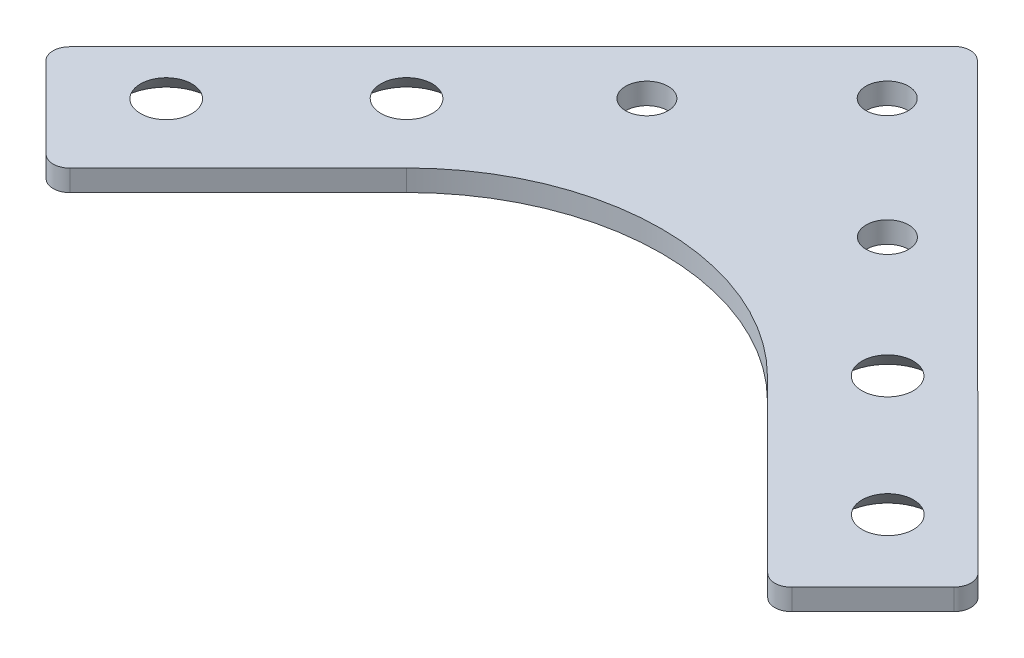
ISO-10303-21;
HEADER;
FILE_DESCRIPTION(('STEP AP214'),'2;1');
FILE_NAME('part.step','',(''),(''),'','','');
FILE_SCHEMA(('AUTOMOTIVE_DESIGN { 1 0 10303 214 1 1 1 1 }'));
ENDSEC;
DATA;
#1=APPLICATION_CONTEXT('core data for automotive mechanical design processes');
#2=APPLICATION_PROTOCOL_DEFINITION('international standard','automotive_design',2000,#1);
#3=PRODUCT_CONTEXT('',#1,'mechanical');
#4=PRODUCT('Part','Part','',(#3));
#5=PRODUCT_RELATED_PRODUCT_CATEGORY('part','',(#4));
#6=PRODUCT_DEFINITION_FORMATION('','',#4);
#7=PRODUCT_DEFINITION_CONTEXT('part definition',#1,'design');
#8=PRODUCT_DEFINITION('design','',#6,#7);
#9=PRODUCT_DEFINITION_SHAPE('','',#8);
#10=(LENGTH_UNIT() NAMED_UNIT(*) SI_UNIT(.MILLI.,.METRE.));
#11=(NAMED_UNIT(*) PLANE_ANGLE_UNIT() SI_UNIT($,.RADIAN.));
#12=(NAMED_UNIT(*) SI_UNIT($,.STERADIAN.) SOLID_ANGLE_UNIT());
#13=UNCERTAINTY_MEASURE_WITH_UNIT(LENGTH_MEASURE(1.E-05),#10,'distance_accuracy_value','');
#14=(GEOMETRIC_REPRESENTATION_CONTEXT(3) GLOBAL_UNCERTAINTY_ASSIGNED_CONTEXT((#13)) GLOBAL_UNIT_ASSIGNED_CONTEXT((#10,
#11,#12)) REPRESENTATION_CONTEXT('',''));
#15=CARTESIAN_POINT('',(0.,0.,0.));
#16=DIRECTION('',(0.,0.,1.));
#17=DIRECTION('',(1.,0.,0.));
#18=AXIS2_PLACEMENT_3D('',#15,#16,#17);
#19=CARTESIAN_POINT('',(175.177811216833,43.8333628767299,-652.315866193784));
#20=DIRECTION('',(0.,1.,0.));
#21=DIRECTION('',(-1.,0.,0.));
#22=AXIS2_PLACEMENT_3D('',#19,#20,#21);
#23=PLANE('',#22);
#24=CARTESIAN_POINT('',(139.293069628941,43.8333628767299,-606.488126001078));
#25=DIRECTION('',(0.,1.,0.));
#26=DIRECTION('',(-1.,0.,0.));
#27=AXIS2_PLACEMENT_3D('',#24,#25,#26);
#28=CIRCLE('',#27,3.84401460743349);
#29=CARTESIAN_POINT('',(135.449055021507,43.8333628767299,-606.488126001078));
#30=VERTEX_POINT('',#29);
#31=EDGE_CURVE('E415',#30,#30,#28,.T.);
#32=ORIENTED_EDGE('',*,*,#31,.F.);
#33=EDGE_LOOP('',(#32));
#34=FACE_BOUND('',#33,.T.);
#35=CARTESIAN_POINT('',(211.135096067288,43.8333628767299,-606.545022677597));
#36=DIRECTION('',(0.,1.,0.));
#37=DIRECTION('',(-1.,0.,0.));
#38=AXIS2_PLACEMENT_3D('',#35,#36,#37);
#39=CIRCLE('',#38,3.84401460743349);
#40=CARTESIAN_POINT('',(207.291081459855,43.8333628767299,-606.545022677597));
#41=VERTEX_POINT('',#40);
#42=EDGE_CURVE('E431',#41,#41,#39,.T.);
#43=ORIENTED_EDGE('',*,*,#42,.F.);
#44=EDGE_LOOP('',(#43));
#45=FACE_BOUND('',#44,.T.);
#46=CARTESIAN_POINT('',(229.109826846005,43.8333628767299,-588.598740237141));
#47=DIRECTION('',(0.,1.,0.));
#48=DIRECTION('',(-1.,0.,0.));
#49=AXIS2_PLACEMENT_3D('',#46,#47,#48);
#50=CIRCLE('',#49,3.84401460743349);
#51=CARTESIAN_POINT('',(225.265812238571,43.8333628767299,-588.598740237141));
#52=VERTEX_POINT('',#51);
#53=EDGE_CURVE('E41',#52,#52,#50,.T.);
#54=ORIENTED_EDGE('',*,*,#53,.F.);
#55=EDGE_LOOP('',(#54));
#56=FACE_BOUND('',#55,.T.);
#57=CARTESIAN_POINT('',(175.177811216833,43.8333628767299,-652.315866193784));
#58=DIRECTION('',(0.,1.,0.));
#59=DIRECTION('',(-1.,0.,0.));
#60=AXIS2_PLACEMENT_3D('',#57,#58,#59);
#61=CIRCLE('',#60,2.53999999999991);
#62=CARTESIAN_POINT('',(176.972439460879,43.8333628767299,-654.113339271656));
#63=VERTEX_POINT('',#62);
#64=CARTESIAN_POINT('',(173.380338138962,43.8333628767299,-654.11049443783));
#65=VERTEX_POINT('',#64);
#66=EDGE_CURVE('E157',#63,#65,#61,.T.);
#67=ORIENTED_EDGE('',*,*,#66,.T.);
#68=DIRECTION('',(0.706546552773901,0.,-0.707666566091204));
#69=VECTOR('',#68,1.);
#70=CARTESIAN_POINT('',(107.427750170282,43.8333628767299,-588.053358826047));
#71=LINE('',#70,#69);
#72=CARTESIAN_POINT('',(107.427750170282,43.8333628767299,-588.053358826047));
#73=VERTEX_POINT('',#72);
#74=EDGE_CURVE('E160',#73,#65,#71,.T.);
#75=ORIENTED_EDGE('',*,*,#74,.F.);
#76=CARTESIAN_POINT('',(109.225223248154,43.8333628767299,-586.258730582001));
#77=DIRECTION('',(0.,-1.,0.));
#78=DIRECTION('',(1.,0.,0.));
#79=AXIS2_PLACEMENT_3D('',#76,#77,#78);
#80=CIRCLE('',#79,2.54000000000001);
#81=CARTESIAN_POINT('',(107.430595004108,43.8333628767299,-584.461257504129));
#82=VERTEX_POINT('',#81);
#83=EDGE_CURVE('E164',#82,#73,#80,.T.);
#84=ORIENTED_EDGE('',*,*,#83,.F.);
#85=DIRECTION('',(0.707666566091211,0.,0.706546552773894));
#86=VECTOR('',#85,1.);
#87=CARTESIAN_POINT('',(107.430595004108,43.8333628767299,-584.461257504129));
#88=LINE('',#87,#86);
#89=CARTESIAN_POINT('',(119.563538279742,43.8333628767299,-572.347516856821));
#90=VERTEX_POINT('',#89);
#91=EDGE_CURVE('E166',#82,#90,#88,.T.);
#92=ORIENTED_EDGE('',*,*,#91,.T.);
#93=CARTESIAN_POINT('',(121.358166523788,43.8333628767299,-574.144989934692));
#94=DIRECTION('',(0.,1.,0.));
#95=DIRECTION('',(-1.,0.,0.));
#96=AXIS2_PLACEMENT_3D('',#93,#94,#95);
#97=CIRCLE('',#96,2.53999999999996);
#98=CARTESIAN_POINT('',(123.15563960166,43.8333628767299,-572.350361690647));
#99=VERTEX_POINT('',#98);
#100=EDGE_CURVE('E169',#90,#99,#97,.T.);
#101=ORIENTED_EDGE('',*,*,#100,.T.);
#102=DIRECTION('',(-0.706546552773895,0.,0.70766656609121));
#103=VECTOR('',#102,1.);
#104=CARTESIAN_POINT('',(148.280435018299,43.8333628767299,-597.51498478085));
#105=LINE('',#104,#103);
#106=CARTESIAN_POINT('',(148.280435018299,43.8333628767299,-597.51498478085));
#107=VERTEX_POINT('',#106);
#108=EDGE_CURVE('E172',#107,#99,#105,.T.);
#109=ORIENTED_EDGE('',*,*,#108,.F.);
#110=CARTESIAN_POINT('',(175.242531186374,43.8333628767299,-570.595561120164));
#111=DIRECTION('',(0.,1.,0.));
#112=DIRECTION('',(-1.,0.,0.));
#113=AXIS2_PLACEMENT_3D('',#110,#111,#112);
#114=CIRCLE('',#113,38.1);
#115=CARTESIAN_POINT('',(202.16195484706,43.8333628767299,-597.557657288239));
#116=VERTEX_POINT('',#115);
#117=EDGE_CURVE('E175',#116,#107,#114,.T.);
#118=ORIENTED_EDGE('',*,*,#117,.F.);
#119=DIRECTION('',(-0.70766656609121,0.,-0.706546552773896));
#120=VECTOR('',#119,1.);
#121=CARTESIAN_POINT('',(227.727905917185,43.8333628767299,-572.032169067485));
#122=LINE('',#121,#120);
#123=CARTESIAN_POINT('',(227.727905917185,43.8333628767299,-572.032169067485));
#124=VERTEX_POINT('',#123);
#125=EDGE_CURVE('E177',#124,#116,#122,.T.);
#126=ORIENTED_EDGE('',*,*,#125,.F.);
#127=CARTESIAN_POINT('',(229.52253416123,43.8333628767299,-573.829642145356));
#128=DIRECTION('',(0.,-1.,0.));
#129=DIRECTION('',(1.,0.,0.));
#130=AXIS2_PLACEMENT_3D('',#127,#128,#129);
#131=CIRCLE('',#130,2.53999999999996);
#132=CARTESIAN_POINT('',(231.320007239102,43.8333628767299,-572.035013901311));
#133=VERTEX_POINT('',#132);
#134=EDGE_CURVE('E179',#133,#124,#131,.T.);
#135=ORIENTED_EDGE('',*,*,#134,.F.);
#136=DIRECTION('',(-0.706546552773897,0.,0.707666566091208));
#137=VECTOR('',#136,1.);
#138=CARTESIAN_POINT('',(243.43374788641,43.8333628767299,-584.167957176944));
#139=LINE('',#138,#137);
#140=CARTESIAN_POINT('',(243.43374788641,43.8333628767299,-584.167957176944));
#141=VERTEX_POINT('',#140);
#142=EDGE_CURVE('E181',#141,#133,#139,.T.);
#143=ORIENTED_EDGE('',*,*,#142,.F.);
#144=CARTESIAN_POINT('',(241.636274808538,43.8333628767299,-585.96258542099));
#145=DIRECTION('',(0.,1.,0.));
#146=DIRECTION('',(-1.,0.,0.));
#147=AXIS2_PLACEMENT_3D('',#144,#145,#146);
#148=CIRCLE('',#147,2.54000000000002);
#149=CARTESIAN_POINT('',(243.430903052584,43.8333628767299,-587.760058498861));
#150=VERTEX_POINT('',#149);
#151=EDGE_CURVE('E138',#141,#150,#148,.T.);
#152=ORIENTED_EDGE('',*,*,#151,.T.);
#153=DIRECTION('',(0.707666566091204,0.,0.706546552773901));
#154=VECTOR('',#153,1.);
#155=CARTESIAN_POINT('',(176.972439460879,43.8333628767299,-654.113339271656));
#156=LINE('',#155,#154);
#157=EDGE_CURVE('E184',#63,#150,#156,.T.);
#158=ORIENTED_EDGE('',*,*,#157,.F.);
#159=EDGE_LOOP('',(#67,#75,#84,#92,#101,#109,#118,#126,#135,#143,#152,#158));
#160=FACE_BOUND('',#159,.T.);
#161=CARTESIAN_POINT('',(157.239352069398,43.8333628767299,-624.462856779795));
#162=DIRECTION('',(0.,-1.,0.));
#163=DIRECTION('',(0.,0.,-1.));
#164=AXIS2_PLACEMENT_3D('',#161,#162,#163);
#165=CIRCLE('',#164,3.17499999999998);
#166=CARTESIAN_POINT('',(157.239352069398,43.8333628767299,-627.637856779795));
#167=VERTEX_POINT('',#166);
#168=EDGE_CURVE('E161',#167,#167,#165,.T.);
#169=ORIENTED_EDGE('',*,*,#168,.T.);
#170=EDGE_LOOP('',(#169));
#171=FACE_BOUND('',#170,.T.);
#172=CARTESIAN_POINT('',(193.160365288572,43.8333628767299,-624.491305118054));
#173=DIRECTION('',(0.,-1.,0.));
#174=DIRECTION('',(0.,0.,-1.));
#175=AXIS2_PLACEMENT_3D('',#172,#173,#174);
#176=CIRCLE('',#175,3.17499999999998);
#177=CARTESIAN_POINT('',(193.160365288572,43.8333628767299,-627.666305118054));
#178=VERTEX_POINT('',#177);
#179=EDGE_CURVE('E446',#178,#178,#176,.T.);
#180=ORIENTED_EDGE('',*,*,#179,.T.);
#181=EDGE_LOOP('',(#180));
#182=FACE_BOUND('',#181,.T.);
#183=CARTESIAN_POINT('',(175.185634509855,43.8333628767299,-642.437587558512));
#184=DIRECTION('',(0.,-1.,0.));
#185=DIRECTION('',(0.,0.,-1.));
#186=AXIS2_PLACEMENT_3D('',#183,#184,#185);
#187=CIRCLE('',#186,3.17499999999998);
#188=CARTESIAN_POINT('',(175.185634509855,43.8333628767299,-645.612587558512));
#189=VERTEX_POINT('',#188);
#190=EDGE_CURVE('E440',#189,#189,#187,.T.);
#191=ORIENTED_EDGE('',*,*,#190,.T.);
#192=EDGE_LOOP('',(#191));
#193=FACE_BOUND('',#192,.T.);
#194=CARTESIAN_POINT('',(121.346787188484,43.8333628767299,-588.513395222362));
#195=DIRECTION('',(0.,1.,0.));
#196=DIRECTION('',(-1.,0.,0.));
#197=AXIS2_PLACEMENT_3D('',#194,#195,#196);
#198=CIRCLE('',#197,3.84401460743348);
#199=CARTESIAN_POINT('',(117.50277258105,43.8333628767299,-588.513395222362));
#200=VERTEX_POINT('',#199);
#201=EDGE_CURVE('E425',#200,#200,#198,.T.);
#202=ORIENTED_EDGE('',*,*,#201,.F.);
#203=EDGE_LOOP('',(#202));
#204=FACE_BOUND('',#203,.T.);
#205=ADVANCED_FACE('F37',(#34,#45,#56,#160,#171,#182,#193,#204),#23,.T.);
#206=CARTESIAN_POINT('',(175.177811216833,40.6583628767299,-652.315866193784));
#207=DIRECTION('',(0.,1.,0.));
#208=DIRECTION('',(-1.,0.,0.));
#209=AXIS2_PLACEMENT_3D('',#206,#207,#208);
#210=CYLINDRICAL_SURFACE('',#209,2.53999999999991);
#211=ORIENTED_EDGE('',*,*,#66,.F.);
#212=DIRECTION('',(0.,1.,0.));
#213=VECTOR('',#212,1.);
#214=CARTESIAN_POINT('',(176.972439460879,40.6583628767299,-654.113339271656));
#215=LINE('',#214,#213);
#216=CARTESIAN_POINT('',(176.972439460879,40.6583628767299,-654.113339271656));
#217=VERTEX_POINT('',#216);
#218=EDGE_CURVE('E11',#217,#63,#215,.T.);
#219=ORIENTED_EDGE('',*,*,#218,.F.);
#220=CARTESIAN_POINT('',(175.177811216833,40.6583628767299,-652.315866193784));
#221=DIRECTION('',(0.,1.,0.));
#222=DIRECTION('',(-1.,0.,0.));
#223=AXIS2_PLACEMENT_3D('',#220,#221,#222);
#224=CIRCLE('',#223,2.53999999999991);
#225=CARTESIAN_POINT('',(173.380338138962,40.6583628767299,-654.11049443783));
#226=VERTEX_POINT('',#225);
#227=EDGE_CURVE('E185',#217,#226,#224,.T.);
#228=ORIENTED_EDGE('',*,*,#227,.T.);
#229=DIRECTION('',(0.,1.,0.));
#230=VECTOR('',#229,1.);
#231=CARTESIAN_POINT('',(173.380338138962,40.6583628767299,-654.11049443783));
#232=LINE('',#231,#230);
#233=EDGE_CURVE('E153',#226,#65,#232,.T.);
#234=ORIENTED_EDGE('',*,*,#233,.T.);
#235=EDGE_LOOP('',(#211,#219,#228,#234));
#236=FACE_BOUND('',#235,.T.);
#237=ADVANCED_FACE('F39',(#236),#210,.T.);
#238=CARTESIAN_POINT('',(176.972439460879,40.6583628767299,-654.113339271656));
#239=DIRECTION('',(-0.706546552773901,0.,0.707666566091204));
#240=DIRECTION('',(0.707666566091204,0.,0.706546552773901));
#241=AXIS2_PLACEMENT_3D('',#238,#239,#240);
#242=PLANE('',#241);
#243=ORIENTED_EDGE('',*,*,#157,.T.);
#244=DIRECTION('',(0.,1.,0.));
#245=VECTOR('',#244,1.);
#246=CARTESIAN_POINT('',(243.430903052584,40.6583628767299,-587.760058498861));
#247=LINE('',#246,#245);
#248=CARTESIAN_POINT('',(243.430903052584,40.6583628767299,-587.760058498861));
#249=VERTEX_POINT('',#248);
#250=EDGE_CURVE('E47',#249,#150,#247,.T.);
#251=ORIENTED_EDGE('',*,*,#250,.F.);
#252=DIRECTION('',(0.707666566091204,0.,0.706546552773901));
#253=VECTOR('',#252,1.);
#254=CARTESIAN_POINT('',(176.972439460879,40.6583628767299,-654.113339271656));
#255=LINE('',#254,#253);
#256=EDGE_CURVE('E151',#217,#249,#255,.T.);
#257=ORIENTED_EDGE('',*,*,#256,.F.);
#258=ORIENTED_EDGE('',*,*,#218,.T.);
#259=EDGE_LOOP('',(#243,#251,#257,#258));
#260=FACE_BOUND('',#259,.T.);
#261=ADVANCED_FACE('F213',(#260),#242,.F.);
#262=CARTESIAN_POINT('',(241.636274808538,40.6583628767299,-585.96258542099));
#263=DIRECTION('',(0.,1.,0.));
#264=DIRECTION('',(-1.,0.,0.));
#265=AXIS2_PLACEMENT_3D('',#262,#263,#264);
#266=CYLINDRICAL_SURFACE('',#265,2.54000000000002);
#267=ORIENTED_EDGE('',*,*,#151,.F.);
#268=DIRECTION('',(0.,1.,0.));
#269=VECTOR('',#268,1.);
#270=CARTESIAN_POINT('',(243.43374788641,40.6583628767299,-584.167957176944));
#271=LINE('',#270,#269);
#272=CARTESIAN_POINT('',(243.43374788641,40.6583628767299,-584.167957176944));
#273=VERTEX_POINT('',#272);
#274=EDGE_CURVE('E132',#273,#141,#271,.T.);
#275=ORIENTED_EDGE('',*,*,#274,.F.);
#276=CARTESIAN_POINT('',(241.636274808538,40.6583628767299,-585.96258542099));
#277=DIRECTION('',(0.,1.,0.));
#278=DIRECTION('',(-1.,0.,0.));
#279=AXIS2_PLACEMENT_3D('',#276,#277,#278);
#280=CIRCLE('',#279,2.54000000000002);
#281=EDGE_CURVE('E136',#273,#249,#280,.T.);
#282=ORIENTED_EDGE('',*,*,#281,.T.);
#283=ORIENTED_EDGE('',*,*,#250,.T.);
#284=EDGE_LOOP('',(#267,#275,#282,#283));
#285=FACE_BOUND('',#284,.T.);
#286=ADVANCED_FACE('F134',(#285),#266,.T.);
#287=CARTESIAN_POINT('',(243.43374788641,40.6583628767299,-584.167957176944));
#288=DIRECTION('',(-0.707666566091208,0.,-0.706546552773897));
#289=DIRECTION('',(-0.706546552773897,0.,0.707666566091208));
#290=AXIS2_PLACEMENT_3D('',#287,#288,#289);
#291=PLANE('',#290);
#292=ORIENTED_EDGE('',*,*,#142,.T.);
#293=DIRECTION('',(0.,1.,0.));
#294=VECTOR('',#293,1.);
#295=CARTESIAN_POINT('',(231.320007239102,40.6583628767299,-572.035013901311));
#296=LINE('',#295,#294);
#297=CARTESIAN_POINT('',(231.320007239102,40.6583628767299,-572.035013901311));
#298=VERTEX_POINT('',#297);
#299=EDGE_CURVE('E141',#298,#133,#296,.T.);
#300=ORIENTED_EDGE('',*,*,#299,.F.);
#301=DIRECTION('',(-0.706546552773897,0.,0.707666566091208));
#302=VECTOR('',#301,1.);
#303=CARTESIAN_POINT('',(243.43374788641,40.6583628767299,-584.167957176944));
#304=LINE('',#303,#302);
#305=EDGE_CURVE('E144',#273,#298,#304,.T.);
#306=ORIENTED_EDGE('',*,*,#305,.F.);
#307=ORIENTED_EDGE('',*,*,#274,.T.);
#308=EDGE_LOOP('',(#292,#300,#306,#307));
#309=FACE_BOUND('',#308,.T.);
#310=ADVANCED_FACE('F145',(#309),#291,.F.);
#311=CARTESIAN_POINT('',(229.52253416123,40.6583628767299,-573.829642145356));
#312=DIRECTION('',(0.,1.,0.));
#313=DIRECTION('',(-1.,0.,0.));
#314=AXIS2_PLACEMENT_3D('',#311,#312,#313);
#315=CYLINDRICAL_SURFACE('',#314,2.53999999999996);
#316=ORIENTED_EDGE('',*,*,#134,.T.);
#317=DIRECTION('',(0.,1.,0.));
#318=VECTOR('',#317,1.);
#319=CARTESIAN_POINT('',(227.727905917185,40.6583628767299,-572.032169067485));
#320=LINE('',#319,#318);
#321=CARTESIAN_POINT('',(227.727905917185,40.6583628767299,-572.032169067485));
#322=VERTEX_POINT('',#321);
#323=EDGE_CURVE('E189',#322,#124,#320,.T.);
#324=ORIENTED_EDGE('',*,*,#323,.F.);
#325=CARTESIAN_POINT('',(229.52253416123,40.6583628767299,-573.829642145356));
#326=DIRECTION('',(0.,-1.,0.));
#327=DIRECTION('',(1.,0.,0.));
#328=AXIS2_PLACEMENT_3D('',#325,#326,#327);
#329=CIRCLE('',#328,2.53999999999996);
#330=EDGE_CURVE('E148',#298,#322,#329,.T.);
#331=ORIENTED_EDGE('',*,*,#330,.F.);
#332=ORIENTED_EDGE('',*,*,#299,.T.);
#333=EDGE_LOOP('',(#316,#324,#331,#332));
#334=FACE_BOUND('',#333,.T.);
#335=ADVANCED_FACE('F236',(#334),#315,.T.);
#336=CARTESIAN_POINT('',(227.727905917185,40.6583628767299,-572.032169067485));
#337=DIRECTION('',(0.706546552773896,0.,-0.70766656609121));
#338=DIRECTION('',(-0.70766656609121,0.,-0.706546552773896));
#339=AXIS2_PLACEMENT_3D('',#336,#337,#338);
#340=PLANE('',#339);
#341=ORIENTED_EDGE('',*,*,#125,.T.);
#342=DIRECTION('',(0.,1.,0.));
#343=VECTOR('',#342,1.);
#344=CARTESIAN_POINT('',(202.16195484706,40.6583628767299,-597.557657288239));
#345=LINE('',#344,#343);
#346=CARTESIAN_POINT('',(202.16195484706,40.6583628767299,-597.557657288239));
#347=VERTEX_POINT('',#346);
#348=EDGE_CURVE('E192',#347,#116,#345,.T.);
#349=ORIENTED_EDGE('',*,*,#348,.F.);
#350=DIRECTION('',(-0.70766656609121,0.,-0.706546552773896));
#351=VECTOR('',#350,1.);
#352=CARTESIAN_POINT('',(227.727905917185,40.6583628767299,-572.032169067485));
#353=LINE('',#352,#351);
#354=EDGE_CURVE('E231',#322,#347,#353,.T.);
#355=ORIENTED_EDGE('',*,*,#354,.F.);
#356=ORIENTED_EDGE('',*,*,#323,.T.);
#357=EDGE_LOOP('',(#341,#349,#355,#356));
#358=FACE_BOUND('',#357,.T.);
#359=ADVANCED_FACE('F240',(#358),#340,.F.);
#360=CARTESIAN_POINT('',(175.242531186374,40.6583628767299,-570.595561120164));
#361=DIRECTION('',(0.,1.,0.));
#362=DIRECTION('',(-1.,0.,0.));
#363=AXIS2_PLACEMENT_3D('',#360,#361,#362);
#364=CYLINDRICAL_SURFACE('',#363,38.1);
#365=ORIENTED_EDGE('',*,*,#117,.T.);
#366=DIRECTION('',(0.,1.,0.));
#367=VECTOR('',#366,1.);
#368=CARTESIAN_POINT('',(148.280435018299,40.6583628767299,-597.51498478085));
#369=LINE('',#368,#367);
#370=CARTESIAN_POINT('',(148.280435018299,40.6583628767299,-597.51498478085));
#371=VERTEX_POINT('',#370);
#372=EDGE_CURVE('E195',#371,#107,#369,.T.);
#373=ORIENTED_EDGE('',*,*,#372,.F.);
#374=CARTESIAN_POINT('',(175.242531186374,40.6583628767299,-570.595561120164));
#375=DIRECTION('',(0.,1.,0.));
#376=DIRECTION('',(-1.,0.,0.));
#377=AXIS2_PLACEMENT_3D('',#374,#375,#376);
#378=CIRCLE('',#377,38.1);
#379=EDGE_CURVE('E229',#347,#371,#378,.T.);
#380=ORIENTED_EDGE('',*,*,#379,.F.);
#381=ORIENTED_EDGE('',*,*,#348,.T.);
#382=EDGE_LOOP('',(#365,#373,#380,#381));
#383=FACE_BOUND('',#382,.T.);
#384=ADVANCED_FACE('F245',(#383),#364,.F.);
#385=CARTESIAN_POINT('',(148.280435018299,40.6583628767299,-597.51498478085));
#386=DIRECTION('',(-0.70766656609121,0.,-0.706546552773895));
#387=DIRECTION('',(-0.706546552773895,0.,0.70766656609121));
#388=AXIS2_PLACEMENT_3D('',#385,#386,#387);
#389=PLANE('',#388);
#390=ORIENTED_EDGE('',*,*,#108,.T.);
#391=DIRECTION('',(0.,1.,0.));
#392=VECTOR('',#391,1.);
#393=CARTESIAN_POINT('',(123.15563960166,40.6583628767299,-572.350361690647));
#394=LINE('',#393,#392);
#395=CARTESIAN_POINT('',(123.15563960166,40.6583628767299,-572.350361690647));
#396=VERTEX_POINT('',#395);
#397=EDGE_CURVE('E198',#396,#99,#394,.T.);
#398=ORIENTED_EDGE('',*,*,#397,.F.);
#399=DIRECTION('',(-0.706546552773895,0.,0.70766656609121));
#400=VECTOR('',#399,1.);
#401=CARTESIAN_POINT('',(148.280435018299,40.6583628767299,-597.51498478085));
#402=LINE('',#401,#400);
#403=EDGE_CURVE('E227',#371,#396,#402,.T.);
#404=ORIENTED_EDGE('',*,*,#403,.F.);
#405=ORIENTED_EDGE('',*,*,#372,.T.);
#406=EDGE_LOOP('',(#390,#398,#404,#405));
#407=FACE_BOUND('',#406,.T.);
#408=ADVANCED_FACE('F251',(#407),#389,.F.);
#409=CARTESIAN_POINT('',(121.358166523788,40.6583628767299,-574.144989934692));
#410=DIRECTION('',(0.,1.,0.));
#411=DIRECTION('',(-1.,0.,0.));
#412=AXIS2_PLACEMENT_3D('',#409,#410,#411);
#413=CYLINDRICAL_SURFACE('',#412,2.53999999999996);
#414=ORIENTED_EDGE('',*,*,#100,.F.);
#415=DIRECTION('',(0.,1.,0.));
#416=VECTOR('',#415,1.);
#417=CARTESIAN_POINT('',(119.563538279742,40.6583628767299,-572.347516856821));
#418=LINE('',#417,#416);
#419=CARTESIAN_POINT('',(119.563538279742,40.6583628767299,-572.347516856821));
#420=VERTEX_POINT('',#419);
#421=EDGE_CURVE('E200',#420,#90,#418,.T.);
#422=ORIENTED_EDGE('',*,*,#421,.F.);
#423=CARTESIAN_POINT('',(121.358166523788,40.6583628767299,-574.144989934692));
#424=DIRECTION('',(0.,1.,0.));
#425=DIRECTION('',(-1.,0.,0.));
#426=AXIS2_PLACEMENT_3D('',#423,#424,#425);
#427=CIRCLE('',#426,2.53999999999996);
#428=EDGE_CURVE('E224',#420,#396,#427,.T.);
#429=ORIENTED_EDGE('',*,*,#428,.T.);
#430=ORIENTED_EDGE('',*,*,#397,.T.);
#431=EDGE_LOOP('',(#414,#422,#429,#430));
#432=FACE_BOUND('',#431,.T.);
#433=ADVANCED_FACE('F255',(#432),#413,.T.);
#434=CARTESIAN_POINT('',(107.430595004108,40.6583628767299,-584.461257504129));
#435=DIRECTION('',(-0.706546552773894,0.,0.707666566091211));
#436=DIRECTION('',(0.707666566091211,0.,0.706546552773894));
#437=AXIS2_PLACEMENT_3D('',#434,#435,#436);
#438=PLANE('',#437);
#439=ORIENTED_EDGE('',*,*,#91,.F.);
#440=DIRECTION('',(0.,1.,0.));
#441=VECTOR('',#440,1.);
#442=CARTESIAN_POINT('',(107.430595004108,40.6583628767299,-584.461257504129));
#443=LINE('',#442,#441);
#444=CARTESIAN_POINT('',(107.430595004108,40.6583628767299,-584.461257504129));
#445=VERTEX_POINT('',#444);
#446=EDGE_CURVE('E202',#445,#82,#443,.T.);
#447=ORIENTED_EDGE('',*,*,#446,.F.);
#448=DIRECTION('',(0.707666566091211,0.,0.706546552773894));
#449=VECTOR('',#448,1.);
#450=CARTESIAN_POINT('',(107.430595004108,40.6583628767299,-584.461257504129));
#451=LINE('',#450,#449);
#452=EDGE_CURVE('E221',#445,#420,#451,.T.);
#453=ORIENTED_EDGE('',*,*,#452,.T.);
#454=ORIENTED_EDGE('',*,*,#421,.T.);
#455=EDGE_LOOP('',(#439,#447,#453,#454));
#456=FACE_BOUND('',#455,.T.);
#457=ADVANCED_FACE('F258',(#456),#438,.T.);
#458=CARTESIAN_POINT('',(109.225223248154,40.6583628767299,-586.258730582001));
#459=DIRECTION('',(0.,1.,0.));
#460=DIRECTION('',(-1.,0.,0.));
#461=AXIS2_PLACEMENT_3D('',#458,#459,#460);
#462=CYLINDRICAL_SURFACE('',#461,2.54000000000001);
#463=ORIENTED_EDGE('',*,*,#83,.T.);
#464=DIRECTION('',(0.,1.,0.));
#465=VECTOR('',#464,1.);
#466=CARTESIAN_POINT('',(107.427750170282,40.6583628767299,-588.053358826047));
#467=LINE('',#466,#465);
#468=CARTESIAN_POINT('',(107.427750170282,40.6583628767299,-588.053358826047));
#469=VERTEX_POINT('',#468);
#470=EDGE_CURVE('E204',#469,#73,#467,.T.);
#471=ORIENTED_EDGE('',*,*,#470,.F.);
#472=CARTESIAN_POINT('',(109.225223248154,40.6583628767299,-586.258730582001));
#473=DIRECTION('',(0.,-1.,0.));
#474=DIRECTION('',(1.,0.,0.));
#475=AXIS2_PLACEMENT_3D('',#472,#473,#474);
#476=CIRCLE('',#475,2.54000000000001);
#477=EDGE_CURVE('E215',#445,#469,#476,.T.);
#478=ORIENTED_EDGE('',*,*,#477,.F.);
#479=ORIENTED_EDGE('',*,*,#446,.T.);
#480=EDGE_LOOP('',(#463,#471,#478,#479));
#481=FACE_BOUND('',#480,.T.);
#482=ADVANCED_FACE('F261',(#481),#462,.T.);
#483=CARTESIAN_POINT('',(107.427750170282,40.6583628767299,-588.053358826047));
#484=DIRECTION('',(0.707666566091204,0.,0.706546552773901));
#485=DIRECTION('',(0.706546552773901,0.,-0.707666566091204));
#486=AXIS2_PLACEMENT_3D('',#483,#484,#485);
#487=PLANE('',#486);
#488=ORIENTED_EDGE('',*,*,#74,.T.);
#489=ORIENTED_EDGE('',*,*,#233,.F.);
#490=DIRECTION('',(0.706546552773901,0.,-0.707666566091204));
#491=VECTOR('',#490,1.);
#492=CARTESIAN_POINT('',(107.427750170282,40.6583628767299,-588.053358826047));
#493=LINE('',#492,#491);
#494=EDGE_CURVE('E107',#469,#226,#493,.T.);
#495=ORIENTED_EDGE('',*,*,#494,.F.);
#496=ORIENTED_EDGE('',*,*,#470,.T.);
#497=EDGE_LOOP('',(#488,#489,#495,#496));
#498=FACE_BOUND('',#497,.T.);
#499=ADVANCED_FACE('F208',(#498),#487,.F.);
#500=CARTESIAN_POINT('',(175.177811216833,40.6583628767299,-652.315866193784));
#501=DIRECTION('',(0.,1.,0.));
#502=DIRECTION('',(-1.,0.,0.));
#503=AXIS2_PLACEMENT_3D('',#500,#501,#502);
#504=PLANE('',#503);
#505=CARTESIAN_POINT('',(139.293069628941,40.6583628767299,-606.488126001078));
#506=DIRECTION('',(0.,-1.,0.));
#507=DIRECTION('',(0.,0.,-1.));
#508=AXIS2_PLACEMENT_3D('',#505,#506,#507);
#509=CIRCLE('',#508,6.604);
#510=CARTESIAN_POINT('',(139.293069628941,40.6583628767299,-613.092126001078));
#511=VERTEX_POINT('',#510);
#512=EDGE_CURVE('E418',#511,#511,#509,.T.);
#513=ORIENTED_EDGE('',*,*,#512,.F.);
#514=EDGE_LOOP('',(#513));
#515=FACE_BOUND('',#514,.T.);
#516=CARTESIAN_POINT('',(121.346787188484,40.6583628767299,-588.513395222362));
#517=DIRECTION('',(0.,-1.,0.));
#518=DIRECTION('',(0.,0.,-1.));
#519=AXIS2_PLACEMENT_3D('',#516,#517,#518);
#520=CIRCLE('',#519,6.604);
#521=CARTESIAN_POINT('',(121.346787188484,40.6583628767299,-595.117395222362));
#522=VERTEX_POINT('',#521);
#523=EDGE_CURVE('E420',#522,#522,#520,.T.);
#524=ORIENTED_EDGE('',*,*,#523,.F.);
#525=EDGE_LOOP('',(#524));
#526=FACE_BOUND('',#525,.T.);
#527=CARTESIAN_POINT('',(211.135096067288,40.6583628767299,-606.545022677597));
#528=DIRECTION('',(0.,-1.,0.));
#529=DIRECTION('',(0.,0.,-1.));
#530=AXIS2_PLACEMENT_3D('',#527,#528,#529);
#531=CIRCLE('',#530,6.604);
#532=CARTESIAN_POINT('',(211.135096067288,40.6583628767299,-613.149022677597));
#533=VERTEX_POINT('',#532);
#534=EDGE_CURVE('E428',#533,#533,#531,.T.);
#535=ORIENTED_EDGE('',*,*,#534,.F.);
#536=EDGE_LOOP('',(#535));
#537=FACE_BOUND('',#536,.T.);
#538=CARTESIAN_POINT('',(229.109826846005,40.6583628767299,-588.598740237141));
#539=DIRECTION('',(0.,-1.,0.));
#540=DIRECTION('',(0.,0.,-1.));
#541=AXIS2_PLACEMENT_3D('',#538,#539,#540);
#542=CIRCLE('',#541,6.604);
#543=CARTESIAN_POINT('',(229.109826846005,40.6583628767299,-595.20274023714));
#544=VERTEX_POINT('',#543);
#545=EDGE_CURVE('E434',#544,#544,#542,.T.);
#546=ORIENTED_EDGE('',*,*,#545,.F.);
#547=EDGE_LOOP('',(#546));
#548=FACE_BOUND('',#547,.T.);
#549=CARTESIAN_POINT('',(175.185634509855,40.6583628767299,-642.437587558512));
#550=DIRECTION('',(0.,-1.,0.));
#551=DIRECTION('',(0.,0.,-1.));
#552=AXIS2_PLACEMENT_3D('',#549,#550,#551);
#553=CIRCLE('',#552,3.17499999999998);
#554=CARTESIAN_POINT('',(175.185634509855,40.6583628767299,-645.612587558512));
#555=VERTEX_POINT('',#554);
#556=EDGE_CURVE('E437',#555,#555,#553,.T.);
#557=ORIENTED_EDGE('',*,*,#556,.F.);
#558=EDGE_LOOP('',(#557));
#559=FACE_BOUND('',#558,.T.);
#560=CARTESIAN_POINT('',(193.160365288572,40.6583628767299,-624.491305118054));
#561=DIRECTION('',(0.,-1.,0.));
#562=DIRECTION('',(0.,0.,-1.));
#563=AXIS2_PLACEMENT_3D('',#560,#561,#562);
#564=CIRCLE('',#563,3.17499999999998);
#565=CARTESIAN_POINT('',(193.160365288572,40.6583628767299,-627.666305118054));
#566=VERTEX_POINT('',#565);
#567=EDGE_CURVE('E443',#566,#566,#564,.T.);
#568=ORIENTED_EDGE('',*,*,#567,.F.);
#569=EDGE_LOOP('',(#568));
#570=FACE_BOUND('',#569,.T.);
#571=CARTESIAN_POINT('',(157.239352069398,40.6583628767299,-624.462856779795));
#572=DIRECTION('',(0.,-1.,0.));
#573=DIRECTION('',(0.,0.,-1.));
#574=AXIS2_PLACEMENT_3D('',#571,#572,#573);
#575=CIRCLE('',#574,3.17499999999998);
#576=CARTESIAN_POINT('',(157.239352069398,40.6583628767299,-627.637856779795));
#577=VERTEX_POINT('',#576);
#578=EDGE_CURVE('E448',#577,#577,#575,.T.);
#579=ORIENTED_EDGE('',*,*,#578,.F.);
#580=EDGE_LOOP('',(#579));
#581=FACE_BOUND('',#580,.T.);
#582=ORIENTED_EDGE('',*,*,#227,.F.);
#583=ORIENTED_EDGE('',*,*,#256,.T.);
#584=ORIENTED_EDGE('',*,*,#281,.F.);
#585=ORIENTED_EDGE('',*,*,#305,.T.);
#586=ORIENTED_EDGE('',*,*,#330,.T.);
#587=ORIENTED_EDGE('',*,*,#354,.T.);
#588=ORIENTED_EDGE('',*,*,#379,.T.);
#589=ORIENTED_EDGE('',*,*,#403,.T.);
#590=ORIENTED_EDGE('',*,*,#428,.F.);
#591=ORIENTED_EDGE('',*,*,#452,.F.);
#592=ORIENTED_EDGE('',*,*,#477,.T.);
#593=ORIENTED_EDGE('',*,*,#494,.T.);
#594=EDGE_LOOP('',(#582,#583,#584,#585,#586,#587,#588,#589,#590,#591,#592,#593));
#595=FACE_BOUND('',#594,.T.);
#596=ADVANCED_FACE('F150',(#515,#526,#537,#548,#559,#570,#581,#595),#504,.F.);
#597=CARTESIAN_POINT('',(157.239352069398,40.6583628767299,-624.462856779795));
#598=DIRECTION('',(0.,-1.,0.));
#599=DIRECTION('',(0.,0.,-1.));
#600=AXIS2_PLACEMENT_3D('',#597,#598,#599);
#601=CYLINDRICAL_SURFACE('',#600,3.17499999999998);
#602=ORIENTED_EDGE('',*,*,#168,.F.);
#603=EDGE_LOOP('',(#602));
#604=FACE_BOUND('',#603,.T.);
#605=ORIENTED_EDGE('',*,*,#578,.T.);
#606=EDGE_LOOP('',(#605));
#607=FACE_BOUND('',#606,.T.);
#608=ADVANCED_FACE('F323',(#604,#607),#601,.F.);
#609=CARTESIAN_POINT('',(193.160365288572,40.6583628767299,-624.491305118054));
#610=DIRECTION('',(0.,-1.,0.));
#611=DIRECTION('',(0.,0.,-1.));
#612=AXIS2_PLACEMENT_3D('',#609,#610,#611);
#613=CYLINDRICAL_SURFACE('',#612,3.17499999999998);
#614=ORIENTED_EDGE('',*,*,#179,.F.);
#615=EDGE_LOOP('',(#614));
#616=FACE_BOUND('',#615,.T.);
#617=ORIENTED_EDGE('',*,*,#567,.T.);
#618=EDGE_LOOP('',(#617));
#619=FACE_BOUND('',#618,.T.);
#620=ADVANCED_FACE('F328',(#616,#619),#613,.F.);
#621=CARTESIAN_POINT('',(175.185634509855,40.6583628767299,-642.437587558512));
#622=DIRECTION('',(0.,-1.,0.));
#623=DIRECTION('',(0.,0.,-1.));
#624=AXIS2_PLACEMENT_3D('',#621,#622,#623);
#625=CYLINDRICAL_SURFACE('',#624,3.17499999999998);
#626=ORIENTED_EDGE('',*,*,#190,.F.);
#627=EDGE_LOOP('',(#626));
#628=FACE_BOUND('',#627,.T.);
#629=ORIENTED_EDGE('',*,*,#556,.T.);
#630=EDGE_LOOP('',(#629));
#631=FACE_BOUND('',#630,.T.);
#632=ADVANCED_FACE('F338',(#628,#631),#625,.F.);
#633=CARTESIAN_POINT('',(229.109826846005,40.6583628767299,-588.598740237141));
#634=DIRECTION('',(0.,-1.,0.));
#635=DIRECTION('',(0.,0.,-1.));
#636=AXIS2_PLACEMENT_3D('',#633,#634,#635);
#637=CONICAL_SURFACE('',#636,6.604,0.715584993317674);
#638=ORIENTED_EDGE('',*,*,#53,.T.);
#639=EDGE_LOOP('',(#638));
#640=FACE_BOUND('',#639,.T.);
#641=ORIENTED_EDGE('',*,*,#545,.T.);
#642=EDGE_LOOP('',(#641));
#643=FACE_BOUND('',#642,.T.);
#644=ADVANCED_FACE('F348',(#640,#643),#637,.F.);
#645=CARTESIAN_POINT('',(211.135096067288,40.6583628767299,-606.545022677597));
#646=DIRECTION('',(0.,-1.,0.));
#647=DIRECTION('',(0.,0.,-1.));
#648=AXIS2_PLACEMENT_3D('',#645,#646,#647);
#649=CONICAL_SURFACE('',#648,6.604,0.715584993317674);
#650=ORIENTED_EDGE('',*,*,#42,.T.);
#651=EDGE_LOOP('',(#650));
#652=FACE_BOUND('',#651,.T.);
#653=ORIENTED_EDGE('',*,*,#534,.T.);
#654=EDGE_LOOP('',(#653));
#655=FACE_BOUND('',#654,.T.);
#656=ADVANCED_FACE('F372',(#652,#655),#649,.F.);
#657=CARTESIAN_POINT('',(121.346787188484,40.6583628767299,-588.513395222362));
#658=DIRECTION('',(0.,-1.,0.));
#659=DIRECTION('',(0.,0.,-1.));
#660=AXIS2_PLACEMENT_3D('',#657,#658,#659);
#661=CONICAL_SURFACE('',#660,6.604,0.715584993317676);
#662=ORIENTED_EDGE('',*,*,#201,.T.);
#663=EDGE_LOOP('',(#662));
#664=FACE_BOUND('',#663,.T.);
#665=ORIENTED_EDGE('',*,*,#523,.T.);
#666=EDGE_LOOP('',(#665));
#667=FACE_BOUND('',#666,.T.);
#668=ADVANCED_FACE('F382',(#664,#667),#661,.F.);
#669=CARTESIAN_POINT('',(139.293069628941,40.6583628767299,-606.488126001078));
#670=DIRECTION('',(0.,-1.,0.));
#671=DIRECTION('',(0.,0.,-1.));
#672=AXIS2_PLACEMENT_3D('',#669,#670,#671);
#673=CONICAL_SURFACE('',#672,6.604,0.715584993317674);
#674=ORIENTED_EDGE('',*,*,#31,.T.);
#675=EDGE_LOOP('',(#674));
#676=FACE_BOUND('',#675,.T.);
#677=ORIENTED_EDGE('',*,*,#512,.T.);
#678=EDGE_LOOP('',(#677));
#679=FACE_BOUND('',#678,.T.);
#680=ADVANCED_FACE('F393',(#676,#679),#673,.F.);
#681=CLOSED_SHELL('',(#205,#237,#261,#286,#310,#335,#359,#384,#408,#433,#457,#482,#499,#596,
#608,#620,#632,#644,#656,#668,#680));
#682=MANIFOLD_SOLID_BREP('B2',#681);
#683=ADVANCED_BREP_SHAPE_REPRESENTATION('',(#18,#682),#14);
#684=SHAPE_DEFINITION_REPRESENTATION(#9,#683);
ENDSEC;
END-ISO-10303-21;
